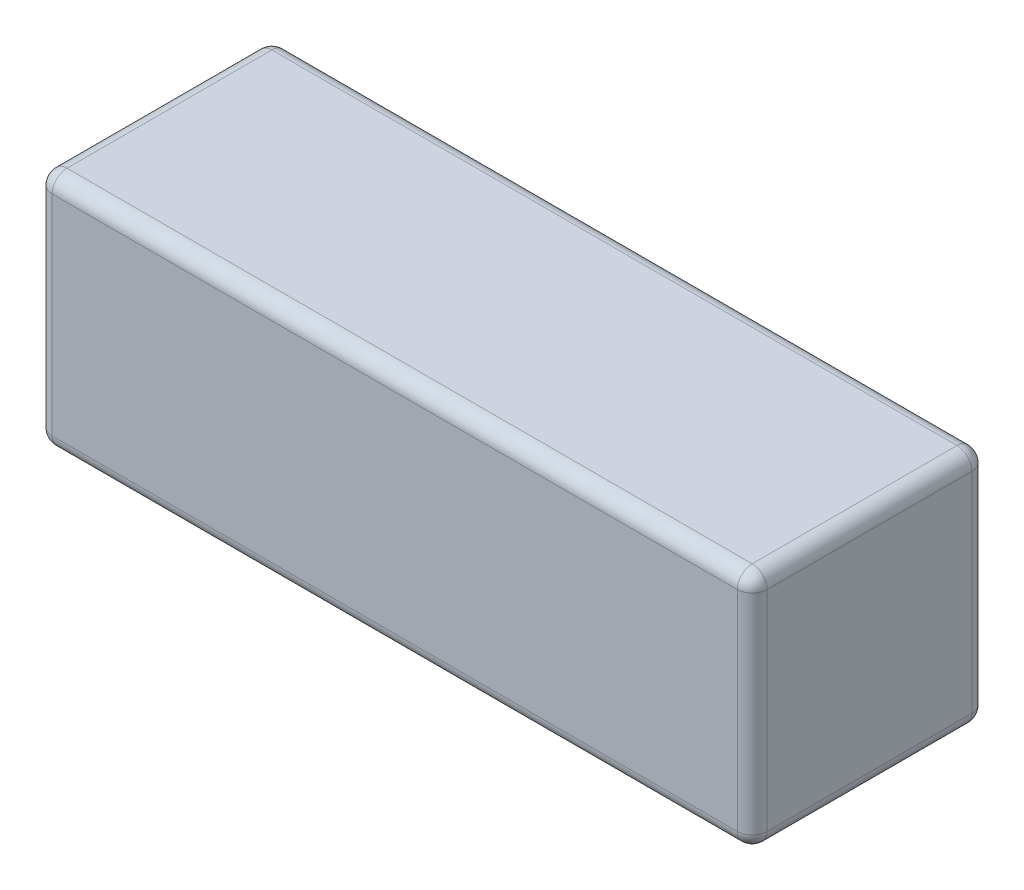
ISO-10303-21;
HEADER;
FILE_DESCRIPTION(('STEP AP214'),'2;1');
FILE_NAME('part.step','',(''),(''),'','','');
FILE_SCHEMA(('AUTOMOTIVE_DESIGN { 1 0 10303 214 1 1 1 1 }'));
ENDSEC;
DATA;
#1=APPLICATION_CONTEXT('core data for automotive mechanical design processes');
#2=APPLICATION_PROTOCOL_DEFINITION('international standard','automotive_design',2000,#1);
#3=PRODUCT_CONTEXT('',#1,'mechanical');
#4=PRODUCT('Part','Part','',(#3));
#5=PRODUCT_RELATED_PRODUCT_CATEGORY('part','',(#4));
#6=PRODUCT_DEFINITION_FORMATION('','',#4);
#7=PRODUCT_DEFINITION_CONTEXT('part definition',#1,'design');
#8=PRODUCT_DEFINITION('design','',#6,#7);
#9=PRODUCT_DEFINITION_SHAPE('','',#8);
#10=(LENGTH_UNIT() NAMED_UNIT(*) SI_UNIT(.MILLI.,.METRE.));
#11=(NAMED_UNIT(*) PLANE_ANGLE_UNIT() SI_UNIT($,.RADIAN.));
#12=(NAMED_UNIT(*) SI_UNIT($,.STERADIAN.) SOLID_ANGLE_UNIT());
#13=UNCERTAINTY_MEASURE_WITH_UNIT(LENGTH_MEASURE(1.E-05),#10,'distance_accuracy_value','');
#14=(GEOMETRIC_REPRESENTATION_CONTEXT(3) GLOBAL_UNCERTAINTY_ASSIGNED_CONTEXT((#13)) GLOBAL_UNIT_ASSIGNED_CONTEXT((#10,
#11,#12)) REPRESENTATION_CONTEXT('',''));
#15=CARTESIAN_POINT('',(0.,0.,0.));
#16=DIRECTION('',(0.,0.,1.));
#17=DIRECTION('',(1.,0.,0.));
#18=AXIS2_PLACEMENT_3D('',#15,#16,#17);
#19=CARTESIAN_POINT('',(-76.2,51.,25.));
#20=DIRECTION('',(1.,0.,0.));
#21=DIRECTION('',(0.,0.,-1.));
#22=AXIS2_PLACEMENT_3D('',#19,#20,#21);
#23=PLANE('',#22);
#24=DIRECTION('',(0.,-1.,0.));
#25=VECTOR('',#24,1.);
#26=CARTESIAN_POINT('',(-76.2,51.,-21.825));
#27=LINE('',#26,#25);
#28=CARTESIAN_POINT('',(-76.2,47.825,-21.825));
#29=VERTEX_POINT('',#28);
#30=CARTESIAN_POINT('',(-76.2,3.175,-21.825));
#31=VERTEX_POINT('',#30);
#32=EDGE_CURVE('E157',#29,#31,#27,.T.);
#33=ORIENTED_EDGE('',*,*,#32,.T.);
#34=DIRECTION('',(0.,0.,1.));
#35=VECTOR('',#34,1.);
#36=CARTESIAN_POINT('',(-76.2,3.175,25.));
#37=LINE('',#36,#35);
#38=CARTESIAN_POINT('',(-76.2,3.175,21.825));
#39=VERTEX_POINT('',#38);
#40=EDGE_CURVE('E234',#31,#39,#37,.T.);
#41=ORIENTED_EDGE('',*,*,#40,.T.);
#42=DIRECTION('',(0.,-1.,0.));
#43=VECTOR('',#42,1.);
#44=CARTESIAN_POINT('',(-76.2,51.,21.825));
#45=LINE('',#44,#43);
#46=CARTESIAN_POINT('',(-76.2,47.825,21.825));
#47=VERTEX_POINT('',#46);
#48=EDGE_CURVE('E227',#39,#47,#45,.F.);
#49=ORIENTED_EDGE('',*,*,#48,.T.);
#50=DIRECTION('',(0.,0.,1.));
#51=VECTOR('',#50,1.);
#52=CARTESIAN_POINT('',(-76.2,47.825,-25.));
#53=LINE('',#52,#51);
#54=EDGE_CURVE('E225',#47,#29,#53,.F.);
#55=ORIENTED_EDGE('',*,*,#54,.T.);
#56=EDGE_LOOP('',(#33,#41,#49,#55));
#57=FACE_BOUND('',#56,.T.);
#58=ADVANCED_FACE('F36',(#57),#23,.F.);
#59=CARTESIAN_POINT('',(76.2,51.,25.));
#60=DIRECTION('',(0.,0.,-1.));
#61=DIRECTION('',(-1.,0.,0.));
#62=AXIS2_PLACEMENT_3D('',#59,#60,#61);
#63=PLANE('',#62);
#64=DIRECTION('',(1.,0.,0.));
#65=VECTOR('',#64,1.);
#66=CARTESIAN_POINT('',(76.2,3.175,25.));
#67=LINE('',#66,#65);
#68=CARTESIAN_POINT('',(-73.025,3.175,25.));
#69=VERTEX_POINT('',#68);
#70=CARTESIAN_POINT('',(73.025,3.175,25.));
#71=VERTEX_POINT('',#70);
#72=EDGE_CURVE('E221',#69,#71,#67,.T.);
#73=ORIENTED_EDGE('',*,*,#72,.T.);
#74=DIRECTION('',(0.,-1.,0.));
#75=VECTOR('',#74,1.);
#76=CARTESIAN_POINT('',(73.025,51.,25.));
#77=LINE('',#76,#75);
#78=CARTESIAN_POINT('',(73.025,47.825,25.));
#79=VERTEX_POINT('',#78);
#80=EDGE_CURVE('E218',#71,#79,#77,.F.);
#81=ORIENTED_EDGE('',*,*,#80,.T.);
#82=DIRECTION('',(1.,0.,0.));
#83=VECTOR('',#82,1.);
#84=CARTESIAN_POINT('',(-76.2,47.825,25.));
#85=LINE('',#84,#83);
#86=CARTESIAN_POINT('',(-73.025,47.825,25.));
#87=VERTEX_POINT('',#86);
#88=EDGE_CURVE('E211',#79,#87,#85,.F.);
#89=ORIENTED_EDGE('',*,*,#88,.T.);
#90=DIRECTION('',(0.,-1.,0.));
#91=VECTOR('',#90,1.);
#92=CARTESIAN_POINT('',(-73.025,51.,25.));
#93=LINE('',#92,#91);
#94=EDGE_CURVE('E214',#87,#69,#93,.T.);
#95=ORIENTED_EDGE('',*,*,#94,.T.);
#96=EDGE_LOOP('',(#73,#81,#89,#95));
#97=FACE_BOUND('',#96,.T.);
#98=ADVANCED_FACE('F219',(#97),#63,.F.);
#99=CARTESIAN_POINT('',(76.2,51.,25.));
#100=DIRECTION('',(-1.,0.,0.));
#101=DIRECTION('',(0.,0.,1.));
#102=AXIS2_PLACEMENT_3D('',#99,#100,#101);
#103=PLANE('',#102);
#104=DIRECTION('',(0.,0.,-1.));
#105=VECTOR('',#104,1.);
#106=CARTESIAN_POINT('',(76.2,3.175,25.));
#107=LINE('',#106,#105);
#108=CARTESIAN_POINT('',(76.2,3.175,21.825));
#109=VERTEX_POINT('',#108);
#110=CARTESIAN_POINT('',(76.2,3.175,-21.825));
#111=VERTEX_POINT('',#110);
#112=EDGE_CURVE('E283',#109,#111,#107,.T.);
#113=ORIENTED_EDGE('',*,*,#112,.T.);
#114=DIRECTION('',(0.,-1.,0.));
#115=VECTOR('',#114,1.);
#116=CARTESIAN_POINT('',(76.2,51.,-21.825));
#117=LINE('',#116,#115);
#118=CARTESIAN_POINT('',(76.2,47.825,-21.825));
#119=VERTEX_POINT('',#118);
#120=EDGE_CURVE('E215',#111,#119,#117,.F.);
#121=ORIENTED_EDGE('',*,*,#120,.T.);
#122=DIRECTION('',(0.,0.,-1.));
#123=VECTOR('',#122,1.);
#124=CARTESIAN_POINT('',(76.2,47.825,25.));
#125=LINE('',#124,#123);
#126=CARTESIAN_POINT('',(76.2,47.825,21.825));
#127=VERTEX_POINT('',#126);
#128=EDGE_CURVE('E276',#119,#127,#125,.F.);
#129=ORIENTED_EDGE('',*,*,#128,.T.);
#130=DIRECTION('',(0.,-1.,0.));
#131=VECTOR('',#130,1.);
#132=CARTESIAN_POINT('',(76.2,51.,21.825));
#133=LINE('',#132,#131);
#134=EDGE_CURVE('E278',#127,#109,#133,.T.);
#135=ORIENTED_EDGE('',*,*,#134,.T.);
#136=EDGE_LOOP('',(#113,#121,#129,#135));
#137=FACE_BOUND('',#136,.T.);
#138=ADVANCED_FACE('F308',(#137),#103,.F.);
#139=CARTESIAN_POINT('',(76.2,51.,-25.));
#140=DIRECTION('',(0.,0.,1.));
#141=DIRECTION('',(1.,0.,0.));
#142=AXIS2_PLACEMENT_3D('',#139,#140,#141);
#143=PLANE('',#142);
#144=DIRECTION('',(0.,-1.,0.));
#145=VECTOR('',#144,1.);
#146=CARTESIAN_POINT('',(73.025,51.,-25.));
#147=LINE('',#146,#145);
#148=CARTESIAN_POINT('',(73.025,47.825,-25.));
#149=VERTEX_POINT('',#148);
#150=CARTESIAN_POINT('',(73.025,3.175,-25.));
#151=VERTEX_POINT('',#150);
#152=EDGE_CURVE('E135',#149,#151,#147,.T.);
#153=ORIENTED_EDGE('',*,*,#152,.T.);
#154=DIRECTION('',(-1.,0.,0.));
#155=VECTOR('',#154,1.);
#156=CARTESIAN_POINT('',(76.2,3.175,-25.));
#157=LINE('',#156,#155);
#158=CARTESIAN_POINT('',(-73.025,3.175,-25.));
#159=VERTEX_POINT('',#158);
#160=EDGE_CURVE('E131',#151,#159,#157,.T.);
#161=ORIENTED_EDGE('',*,*,#160,.T.);
#162=DIRECTION('',(0.,-1.,0.));
#163=VECTOR('',#162,1.);
#164=CARTESIAN_POINT('',(-73.025,51.,-25.));
#165=LINE('',#164,#163);
#166=CARTESIAN_POINT('',(-73.025,47.825,-25.));
#167=VERTEX_POINT('',#166);
#168=EDGE_CURVE('E125',#159,#167,#165,.F.);
#169=ORIENTED_EDGE('',*,*,#168,.T.);
#170=DIRECTION('',(-1.,0.,0.));
#171=VECTOR('',#170,1.);
#172=CARTESIAN_POINT('',(76.2,47.825,-25.));
#173=LINE('',#172,#171);
#174=EDGE_CURVE('E128',#167,#149,#173,.F.);
#175=ORIENTED_EDGE('',*,*,#174,.T.);
#176=EDGE_LOOP('',(#153,#161,#169,#175));
#177=FACE_BOUND('',#176,.T.);
#178=ADVANCED_FACE('F127',(#177),#143,.F.);
#179=CARTESIAN_POINT('',(0.,51.,0.));
#180=DIRECTION('',(0.,1.,0.));
#181=DIRECTION('',(0.,0.,1.));
#182=AXIS2_PLACEMENT_3D('',#179,#180,#181);
#183=PLANE('',#182);
#184=DIRECTION('',(0.,0.,-1.));
#185=VECTOR('',#184,1.);
#186=CARTESIAN_POINT('',(73.025,51.,-25.));
#187=LINE('',#186,#185);
#188=CARTESIAN_POINT('',(73.025,51.,21.825));
#189=VERTEX_POINT('',#188);
#190=CARTESIAN_POINT('',(73.025,51.,-21.825));
#191=VERTEX_POINT('',#190);
#192=EDGE_CURVE('E45',#189,#191,#187,.T.);
#193=ORIENTED_EDGE('',*,*,#192,.T.);
#194=DIRECTION('',(-1.,0.,0.));
#195=VECTOR('',#194,1.);
#196=CARTESIAN_POINT('',(-76.2,51.,-21.825));
#197=LINE('',#196,#195);
#198=CARTESIAN_POINT('',(-73.025,51.,-21.825));
#199=VERTEX_POINT('',#198);
#200=EDGE_CURVE('E11',#191,#199,#197,.T.);
#201=ORIENTED_EDGE('',*,*,#200,.T.);
#202=DIRECTION('',(0.,0.,1.));
#203=VECTOR('',#202,1.);
#204=CARTESIAN_POINT('',(-73.025,51.,25.));
#205=LINE('',#204,#203);
#206=CARTESIAN_POINT('',(-73.025,51.,21.825));
#207=VERTEX_POINT('',#206);
#208=EDGE_CURVE('E236',#199,#207,#205,.T.);
#209=ORIENTED_EDGE('',*,*,#208,.T.);
#210=DIRECTION('',(1.,0.,0.));
#211=VECTOR('',#210,1.);
#212=CARTESIAN_POINT('',(76.2,51.,21.825));
#213=LINE('',#212,#211);
#214=EDGE_CURVE('E56',#207,#189,#213,.T.);
#215=ORIENTED_EDGE('',*,*,#214,.T.);
#216=EDGE_LOOP('',(#193,#201,#209,#215));
#217=FACE_BOUND('',#216,.T.);
#218=ADVANCED_FACE('F486',(#217),#183,.T.);
#219=CARTESIAN_POINT('',(0.,0.,0.));
#220=DIRECTION('',(0.,1.,0.));
#221=DIRECTION('',(0.,0.,1.));
#222=AXIS2_PLACEMENT_3D('',#219,#220,#221);
#223=PLANE('',#222);
#224=DIRECTION('',(0.,0.,1.));
#225=VECTOR('',#224,1.);
#226=CARTESIAN_POINT('',(-73.025,0.,0.));
#227=LINE('',#226,#225);
#228=CARTESIAN_POINT('',(-73.025,0.,21.825));
#229=VERTEX_POINT('',#228);
#230=CARTESIAN_POINT('',(-73.025,0.,-21.825));
#231=VERTEX_POINT('',#230);
#232=EDGE_CURVE('E272',#229,#231,#227,.F.);
#233=ORIENTED_EDGE('',*,*,#232,.T.);
#234=DIRECTION('',(-1.,0.,0.));
#235=VECTOR('',#234,1.);
#236=CARTESIAN_POINT('',(0.,0.,-21.825));
#237=LINE('',#236,#235);
#238=CARTESIAN_POINT('',(73.025,0.,-21.825));
#239=VERTEX_POINT('',#238);
#240=EDGE_CURVE('E266',#231,#239,#237,.F.);
#241=ORIENTED_EDGE('',*,*,#240,.T.);
#242=DIRECTION('',(0.,0.,-1.));
#243=VECTOR('',#242,1.);
#244=CARTESIAN_POINT('',(73.025,0.,0.));
#245=LINE('',#244,#243);
#246=CARTESIAN_POINT('',(73.025,0.,21.825));
#247=VERTEX_POINT('',#246);
#248=EDGE_CURVE('E260',#239,#247,#245,.F.);
#249=ORIENTED_EDGE('',*,*,#248,.T.);
#250=DIRECTION('',(1.,0.,0.));
#251=VECTOR('',#250,1.);
#252=CARTESIAN_POINT('',(0.,0.,21.825));
#253=LINE('',#252,#251);
#254=EDGE_CURVE('E267',#247,#229,#253,.F.);
#255=ORIENTED_EDGE('',*,*,#254,.T.);
#256=EDGE_LOOP('',(#233,#241,#249,#255));
#257=FACE_BOUND('',#256,.T.);
#258=ADVANCED_FACE('F270',(#257),#223,.F.);
#259=CARTESIAN_POINT('',(0.,47.825,21.825));
#260=DIRECTION('',(-1.,0.,0.));
#261=DIRECTION('',(0.,0.,1.));
#262=AXIS2_PLACEMENT_3D('',#259,#260,#261);
#263=CYLINDRICAL_SURFACE('',#262,3.175);
#264=CARTESIAN_POINT('',(73.025,47.825,21.825));
#265=DIRECTION('',(1.,0.,0.));
#266=DIRECTION('',(0.,0.,-1.));
#267=AXIS2_PLACEMENT_3D('',#264,#265,#266);
#268=CIRCLE('',#267,3.175);
#269=EDGE_CURVE('E40',#189,#79,#268,.T.);
#270=ORIENTED_EDGE('',*,*,#269,.F.);
#271=ORIENTED_EDGE('',*,*,#214,.F.);
#272=CARTESIAN_POINT('',(-73.025,47.825,21.825));
#273=DIRECTION('',(-1.,0.,0.));
#274=DIRECTION('',(0.,-1.,0.));
#275=AXIS2_PLACEMENT_3D('',#272,#273,#274);
#276=CIRCLE('',#275,3.175);
#277=EDGE_CURVE('E197',#87,#207,#276,.T.);
#278=ORIENTED_EDGE('',*,*,#277,.F.);
#279=ORIENTED_EDGE('',*,*,#88,.F.);
#280=EDGE_LOOP('',(#270,#271,#278,#279));
#281=FACE_BOUND('',#280,.T.);
#282=ADVANCED_FACE('F38',(#281),#263,.T.);
#283=CARTESIAN_POINT('',(73.025,47.825,21.825));
#284=DIRECTION('',(0.,0.,1.));
#285=DIRECTION('',(1.,0.,0.));
#286=AXIS2_PLACEMENT_3D('',#283,#284,#285);
#287=SPHERICAL_SURFACE('',#286,3.175);
#288=CARTESIAN_POINT('',(73.025,47.825,21.825));
#289=DIRECTION('',(0.,0.,1.));
#290=DIRECTION('',(1.,0.,0.));
#291=AXIS2_PLACEMENT_3D('',#288,#289,#290);
#292=CIRCLE('',#291,3.175);
#293=EDGE_CURVE('E193',#189,#127,#292,.F.);
#294=ORIENTED_EDGE('',*,*,#293,.F.);
#295=ORIENTED_EDGE('',*,*,#269,.T.);
#296=CARTESIAN_POINT('',(73.025,47.825,21.825));
#297=DIRECTION('',(0.,1.,0.));
#298=DIRECTION('',(0.,0.,1.));
#299=AXIS2_PLACEMENT_3D('',#296,#297,#298);
#300=CIRCLE('',#299,3.175);
#301=EDGE_CURVE('E196',#127,#79,#300,.F.);
#302=ORIENTED_EDGE('',*,*,#301,.F.);
#303=EDGE_LOOP('',(#294,#295,#302));
#304=FACE_BOUND('',#303,.T.);
#305=ADVANCED_FACE('F208',(#304),#287,.T.);
#306=CARTESIAN_POINT('',(-73.025,47.825,21.825));
#307=DIRECTION('',(0.,0.,1.));
#308=DIRECTION('',(1.,0.,0.));
#309=AXIS2_PLACEMENT_3D('',#306,#307,#308);
#310=SPHERICAL_SURFACE('',#309,3.175);
#311=CARTESIAN_POINT('',(-73.025,47.825,21.825));
#312=DIRECTION('',(0.,1.,0.));
#313=DIRECTION('',(0.,0.,1.));
#314=AXIS2_PLACEMENT_3D('',#311,#312,#313);
#315=CIRCLE('',#314,3.175);
#316=EDGE_CURVE('E187',#87,#47,#315,.F.);
#317=ORIENTED_EDGE('',*,*,#316,.F.);
#318=ORIENTED_EDGE('',*,*,#277,.T.);
#319=CARTESIAN_POINT('',(-73.025,47.825,21.825));
#320=DIRECTION('',(0.,0.,1.));
#321=DIRECTION('',(1.,0.,0.));
#322=AXIS2_PLACEMENT_3D('',#319,#320,#321);
#323=CIRCLE('',#322,3.175);
#324=EDGE_CURVE('E190',#47,#207,#323,.F.);
#325=ORIENTED_EDGE('',*,*,#324,.F.);
#326=EDGE_LOOP('',(#317,#318,#325));
#327=FACE_BOUND('',#326,.T.);
#328=ADVANCED_FACE('F459',(#327),#310,.T.);
#329=CARTESIAN_POINT('',(73.025,51.,21.825));
#330=DIRECTION('',(0.,-1.,0.));
#331=DIRECTION('',(0.,0.,-1.));
#332=AXIS2_PLACEMENT_3D('',#329,#330,#331);
#333=CYLINDRICAL_SURFACE('',#332,3.175);
#334=ORIENTED_EDGE('',*,*,#301,.T.);
#335=ORIENTED_EDGE('',*,*,#80,.F.);
#336=CARTESIAN_POINT('',(73.025,3.175,21.825));
#337=DIRECTION('',(0.,-1.,0.));
#338=DIRECTION('',(0.,0.,-1.));
#339=AXIS2_PLACEMENT_3D('',#336,#337,#338);
#340=CIRCLE('',#339,3.175);
#341=EDGE_CURVE('E181',#109,#71,#340,.T.);
#342=ORIENTED_EDGE('',*,*,#341,.F.);
#343=ORIENTED_EDGE('',*,*,#134,.F.);
#344=EDGE_LOOP('',(#334,#335,#342,#343));
#345=FACE_BOUND('',#344,.T.);
#346=ADVANCED_FACE('F310',(#345),#333,.T.);
#347=CARTESIAN_POINT('',(73.025,47.825,0.));
#348=DIRECTION('',(0.,0.,1.));
#349=DIRECTION('',(1.,0.,0.));
#350=AXIS2_PLACEMENT_3D('',#347,#348,#349);
#351=CYLINDRICAL_SURFACE('',#350,3.175);
#352=ORIENTED_EDGE('',*,*,#293,.T.);
#353=ORIENTED_EDGE('',*,*,#128,.F.);
#354=CARTESIAN_POINT('',(73.025,47.825,-21.825));
#355=DIRECTION('',(0.,0.,-1.));
#356=DIRECTION('',(-1.,0.,0.));
#357=AXIS2_PLACEMENT_3D('',#354,#355,#356);
#358=CIRCLE('',#357,3.175);
#359=EDGE_CURVE('E178',#191,#119,#358,.T.);
#360=ORIENTED_EDGE('',*,*,#359,.F.);
#361=ORIENTED_EDGE('',*,*,#192,.F.);
#362=EDGE_LOOP('',(#352,#353,#360,#361));
#363=FACE_BOUND('',#362,.T.);
#364=ADVANCED_FACE('F443',(#363),#351,.T.);
#365=CARTESIAN_POINT('',(0.,47.825,-21.825));
#366=DIRECTION('',(1.,0.,0.));
#367=DIRECTION('',(0.,0.,-1.));
#368=AXIS2_PLACEMENT_3D('',#365,#366,#367);
#369=CYLINDRICAL_SURFACE('',#368,3.175);
#370=CARTESIAN_POINT('',(-73.025,47.825,-21.825));
#371=DIRECTION('',(-1.,0.,0.));
#372=DIRECTION('',(0.,0.,1.));
#373=AXIS2_PLACEMENT_3D('',#370,#371,#372);
#374=CIRCLE('',#373,3.175);
#375=EDGE_CURVE('E141',#199,#167,#374,.T.);
#376=ORIENTED_EDGE('',*,*,#375,.F.);
#377=ORIENTED_EDGE('',*,*,#200,.F.);
#378=CARTESIAN_POINT('',(73.025,47.825,-21.825));
#379=DIRECTION('',(1.,0.,0.));
#380=DIRECTION('',(0.,0.,-1.));
#381=AXIS2_PLACEMENT_3D('',#378,#379,#380);
#382=CIRCLE('',#381,3.175);
#383=EDGE_CURVE('E144',#149,#191,#382,.T.);
#384=ORIENTED_EDGE('',*,*,#383,.F.);
#385=ORIENTED_EDGE('',*,*,#174,.F.);
#386=EDGE_LOOP('',(#376,#377,#384,#385));
#387=FACE_BOUND('',#386,.T.);
#388=ADVANCED_FACE('F140',(#387),#369,.T.);
#389=CARTESIAN_POINT('',(-73.025,47.825,0.));
#390=DIRECTION('',(0.,0.,-1.));
#391=DIRECTION('',(-1.,0.,0.));
#392=AXIS2_PLACEMENT_3D('',#389,#390,#391);
#393=CYLINDRICAL_SURFACE('',#392,3.175);
#394=ORIENTED_EDGE('',*,*,#324,.T.);
#395=ORIENTED_EDGE('',*,*,#208,.F.);
#396=CARTESIAN_POINT('',(-73.025,47.825,-21.825));
#397=DIRECTION('',(0.,0.,-1.));
#398=DIRECTION('',(0.,1.,0.));
#399=AXIS2_PLACEMENT_3D('',#396,#397,#398);
#400=CIRCLE('',#399,3.175);
#401=EDGE_CURVE('E153',#29,#199,#400,.T.);
#402=ORIENTED_EDGE('',*,*,#401,.F.);
#403=ORIENTED_EDGE('',*,*,#54,.F.);
#404=EDGE_LOOP('',(#394,#395,#402,#403));
#405=FACE_BOUND('',#404,.T.);
#406=ADVANCED_FACE('F427',(#405),#393,.T.);
#407=CARTESIAN_POINT('',(-73.025,51.,21.825));
#408=DIRECTION('',(0.,-1.,0.));
#409=DIRECTION('',(0.,0.,-1.));
#410=AXIS2_PLACEMENT_3D('',#407,#408,#409);
#411=CYLINDRICAL_SURFACE('',#410,3.175);
#412=ORIENTED_EDGE('',*,*,#316,.T.);
#413=ORIENTED_EDGE('',*,*,#48,.F.);
#414=CARTESIAN_POINT('',(-73.025,3.175,21.825));
#415=DIRECTION('',(0.,-1.,0.));
#416=DIRECTION('',(0.,0.,-1.));
#417=AXIS2_PLACEMENT_3D('',#414,#415,#416);
#418=CIRCLE('',#417,3.175);
#419=EDGE_CURVE('E173',#69,#39,#418,.T.);
#420=ORIENTED_EDGE('',*,*,#419,.F.);
#421=ORIENTED_EDGE('',*,*,#94,.F.);
#422=EDGE_LOOP('',(#412,#413,#420,#421));
#423=FACE_BOUND('',#422,.T.);
#424=ADVANCED_FACE('F294',(#423),#411,.T.);
#425=CARTESIAN_POINT('',(76.2,3.175,21.825));
#426=DIRECTION('',(1.,0.,0.));
#427=DIRECTION('',(0.,0.,-1.));
#428=AXIS2_PLACEMENT_3D('',#425,#426,#427);
#429=CYLINDRICAL_SURFACE('',#428,3.175);
#430=CARTESIAN_POINT('',(73.025,3.175,21.825));
#431=DIRECTION('',(1.,0.,0.));
#432=DIRECTION('',(0.,0.,-1.));
#433=AXIS2_PLACEMENT_3D('',#430,#431,#432);
#434=CIRCLE('',#433,3.175);
#435=EDGE_CURVE('E184',#71,#247,#434,.T.);
#436=ORIENTED_EDGE('',*,*,#435,.F.);
#437=ORIENTED_EDGE('',*,*,#72,.F.);
#438=CARTESIAN_POINT('',(-73.025,3.175,21.825));
#439=DIRECTION('',(-1.,0.,0.));
#440=DIRECTION('',(0.,0.,1.));
#441=AXIS2_PLACEMENT_3D('',#438,#439,#440);
#442=CIRCLE('',#441,3.175);
#443=EDGE_CURVE('E170',#229,#69,#442,.T.);
#444=ORIENTED_EDGE('',*,*,#443,.F.);
#445=ORIENTED_EDGE('',*,*,#254,.F.);
#446=EDGE_LOOP('',(#436,#437,#444,#445));
#447=FACE_BOUND('',#446,.T.);
#448=ADVANCED_FACE('F291',(#447),#429,.T.);
#449=CARTESIAN_POINT('',(73.025,3.175,21.825));
#450=DIRECTION('',(0.,0.,1.));
#451=DIRECTION('',(1.,0.,0.));
#452=AXIS2_PLACEMENT_3D('',#449,#450,#451);
#453=SPHERICAL_SURFACE('',#452,3.175);
#454=ORIENTED_EDGE('',*,*,#341,.T.);
#455=ORIENTED_EDGE('',*,*,#435,.T.);
#456=CARTESIAN_POINT('',(73.025,3.175,21.825));
#457=DIRECTION('',(0.,0.,1.));
#458=DIRECTION('',(1.,0.,0.));
#459=AXIS2_PLACEMENT_3D('',#456,#457,#458);
#460=CIRCLE('',#459,3.175);
#461=EDGE_CURVE('E161',#109,#247,#460,.F.);
#462=ORIENTED_EDGE('',*,*,#461,.F.);
#463=EDGE_LOOP('',(#454,#455,#462));
#464=FACE_BOUND('',#463,.T.);
#465=ADVANCED_FACE('F312',(#464),#453,.T.);
#466=CARTESIAN_POINT('',(73.025,47.825,-21.825));
#467=DIRECTION('',(0.,0.,1.));
#468=DIRECTION('',(1.,0.,0.));
#469=AXIS2_PLACEMENT_3D('',#466,#467,#468);
#470=SPHERICAL_SURFACE('',#469,3.175);
#471=ORIENTED_EDGE('',*,*,#383,.T.);
#472=ORIENTED_EDGE('',*,*,#359,.T.);
#473=CARTESIAN_POINT('',(73.025,47.825,-21.825));
#474=DIRECTION('',(0.,1.,0.));
#475=DIRECTION('',(0.,0.,1.));
#476=AXIS2_PLACEMENT_3D('',#473,#474,#475);
#477=CIRCLE('',#476,3.175);
#478=EDGE_CURVE('E158',#149,#119,#477,.F.);
#479=ORIENTED_EDGE('',*,*,#478,.F.);
#480=EDGE_LOOP('',(#471,#472,#479));
#481=FACE_BOUND('',#480,.T.);
#482=ADVANCED_FACE('F314',(#481),#470,.T.);
#483=CARTESIAN_POINT('',(-73.025,47.825,-21.825));
#484=DIRECTION('',(0.,0.,1.));
#485=DIRECTION('',(1.,0.,0.));
#486=AXIS2_PLACEMENT_3D('',#483,#484,#485);
#487=SPHERICAL_SURFACE('',#486,3.175);
#488=ORIENTED_EDGE('',*,*,#401,.T.);
#489=ORIENTED_EDGE('',*,*,#375,.T.);
#490=CARTESIAN_POINT('',(-73.025,47.825,-21.825));
#491=DIRECTION('',(0.,1.,0.));
#492=DIRECTION('',(0.,0.,1.));
#493=AXIS2_PLACEMENT_3D('',#490,#491,#492);
#494=CIRCLE('',#493,3.175);
#495=EDGE_CURVE('E150',#29,#167,#494,.F.);
#496=ORIENTED_EDGE('',*,*,#495,.F.);
#497=EDGE_LOOP('',(#488,#489,#496));
#498=FACE_BOUND('',#497,.T.);
#499=ADVANCED_FACE('F149',(#498),#487,.T.);
#500=CARTESIAN_POINT('',(-73.025,3.175,21.825));
#501=DIRECTION('',(0.,0.,1.));
#502=DIRECTION('',(1.,0.,0.));
#503=AXIS2_PLACEMENT_3D('',#500,#501,#502);
#504=SPHERICAL_SURFACE('',#503,3.175);
#505=ORIENTED_EDGE('',*,*,#443,.T.);
#506=ORIENTED_EDGE('',*,*,#419,.T.);
#507=CARTESIAN_POINT('',(-73.025,3.175,21.825));
#508=DIRECTION('',(0.,0.,1.));
#509=DIRECTION('',(1.,0.,0.));
#510=AXIS2_PLACEMENT_3D('',#507,#508,#509);
#511=CIRCLE('',#510,3.175);
#512=EDGE_CURVE('E159',#229,#39,#511,.F.);
#513=ORIENTED_EDGE('',*,*,#512,.F.);
#514=EDGE_LOOP('',(#505,#506,#513));
#515=FACE_BOUND('',#514,.T.);
#516=ADVANCED_FACE('F296',(#515),#504,.T.);
#517=CARTESIAN_POINT('',(73.025,3.175,25.));
#518=DIRECTION('',(0.,0.,-1.));
#519=DIRECTION('',(-1.,0.,0.));
#520=AXIS2_PLACEMENT_3D('',#517,#518,#519);
#521=CYLINDRICAL_SURFACE('',#520,3.175);
#522=ORIENTED_EDGE('',*,*,#461,.T.);
#523=ORIENTED_EDGE('',*,*,#248,.F.);
#524=CARTESIAN_POINT('',(73.025,3.175,-21.825));
#525=DIRECTION('',(0.,0.,-1.));
#526=DIRECTION('',(-1.,0.,0.));
#527=AXIS2_PLACEMENT_3D('',#524,#525,#526);
#528=CIRCLE('',#527,3.175);
#529=EDGE_CURVE('E164',#111,#239,#528,.T.);
#530=ORIENTED_EDGE('',*,*,#529,.F.);
#531=ORIENTED_EDGE('',*,*,#112,.F.);
#532=EDGE_LOOP('',(#522,#523,#530,#531));
#533=FACE_BOUND('',#532,.T.);
#534=ADVANCED_FACE('F262',(#533),#521,.T.);
#535=CARTESIAN_POINT('',(73.025,51.,-21.825));
#536=DIRECTION('',(0.,-1.,0.));
#537=DIRECTION('',(0.,0.,-1.));
#538=AXIS2_PLACEMENT_3D('',#535,#536,#537);
#539=CYLINDRICAL_SURFACE('',#538,3.175);
#540=ORIENTED_EDGE('',*,*,#478,.T.);
#541=ORIENTED_EDGE('',*,*,#120,.F.);
#542=CARTESIAN_POINT('',(73.025,3.175,-21.825));
#543=DIRECTION('',(0.,-1.,0.));
#544=DIRECTION('',(0.,0.,-1.));
#545=AXIS2_PLACEMENT_3D('',#542,#543,#544);
#546=CIRCLE('',#545,3.175);
#547=EDGE_CURVE('E249',#151,#111,#546,.T.);
#548=ORIENTED_EDGE('',*,*,#547,.F.);
#549=ORIENTED_EDGE('',*,*,#152,.F.);
#550=EDGE_LOOP('',(#540,#541,#548,#549));
#551=FACE_BOUND('',#550,.T.);
#552=ADVANCED_FACE('F306',(#551),#539,.T.);
#553=CARTESIAN_POINT('',(-73.025,51.,-21.825));
#554=DIRECTION('',(0.,-1.,0.));
#555=DIRECTION('',(0.,0.,-1.));
#556=AXIS2_PLACEMENT_3D('',#553,#554,#555);
#557=CYLINDRICAL_SURFACE('',#556,3.175);
#558=ORIENTED_EDGE('',*,*,#495,.T.);
#559=ORIENTED_EDGE('',*,*,#168,.F.);
#560=CARTESIAN_POINT('',(-73.025,3.175,-21.825));
#561=DIRECTION('',(0.,-1.,0.));
#562=DIRECTION('',(0.,0.,-1.));
#563=AXIS2_PLACEMENT_3D('',#560,#561,#562);
#564=CIRCLE('',#563,3.175);
#565=EDGE_CURVE('E246',#31,#159,#564,.T.);
#566=ORIENTED_EDGE('',*,*,#565,.F.);
#567=ORIENTED_EDGE('',*,*,#32,.F.);
#568=EDGE_LOOP('',(#558,#559,#566,#567));
#569=FACE_BOUND('',#568,.T.);
#570=ADVANCED_FACE('F155',(#569),#557,.T.);
#571=CARTESIAN_POINT('',(-73.025,3.175,25.));
#572=DIRECTION('',(0.,0.,1.));
#573=DIRECTION('',(1.,0.,0.));
#574=AXIS2_PLACEMENT_3D('',#571,#572,#573);
#575=CYLINDRICAL_SURFACE('',#574,3.175);
#576=ORIENTED_EDGE('',*,*,#512,.T.);
#577=ORIENTED_EDGE('',*,*,#40,.F.);
#578=CARTESIAN_POINT('',(-73.025,3.175,-21.825));
#579=DIRECTION('',(0.,0.,-1.));
#580=DIRECTION('',(-1.,0.,0.));
#581=AXIS2_PLACEMENT_3D('',#578,#579,#580);
#582=CIRCLE('',#581,3.175);
#583=EDGE_CURVE('E244',#231,#31,#582,.T.);
#584=ORIENTED_EDGE('',*,*,#583,.F.);
#585=ORIENTED_EDGE('',*,*,#232,.F.);
#586=EDGE_LOOP('',(#576,#577,#584,#585));
#587=FACE_BOUND('',#586,.T.);
#588=ADVANCED_FACE('F299',(#587),#575,.T.);
#589=CARTESIAN_POINT('',(73.025,3.175,-21.825));
#590=DIRECTION('',(0.,0.,1.));
#591=DIRECTION('',(1.,0.,0.));
#592=AXIS2_PLACEMENT_3D('',#589,#590,#591);
#593=SPHERICAL_SURFACE('',#592,3.175);
#594=ORIENTED_EDGE('',*,*,#547,.T.);
#595=ORIENTED_EDGE('',*,*,#529,.T.);
#596=CARTESIAN_POINT('',(73.025,3.175,-21.825));
#597=DIRECTION('',(1.,0.,0.));
#598=DIRECTION('',(0.,0.,-1.));
#599=AXIS2_PLACEMENT_3D('',#596,#597,#598);
#600=CIRCLE('',#599,3.175);
#601=EDGE_CURVE('E242',#151,#239,#600,.F.);
#602=ORIENTED_EDGE('',*,*,#601,.F.);
#603=EDGE_LOOP('',(#594,#595,#602));
#604=FACE_BOUND('',#603,.T.);
#605=ADVANCED_FACE('F256',(#604),#593,.T.);
#606=CARTESIAN_POINT('',(-73.025,3.175,-21.825));
#607=DIRECTION('',(0.,0.,1.));
#608=DIRECTION('',(1.,0.,0.));
#609=AXIS2_PLACEMENT_3D('',#606,#607,#608);
#610=SPHERICAL_SURFACE('',#609,3.175);
#611=ORIENTED_EDGE('',*,*,#583,.T.);
#612=ORIENTED_EDGE('',*,*,#565,.T.);
#613=CARTESIAN_POINT('',(-73.025,3.175,-21.825));
#614=DIRECTION('',(-1.,0.,0.));
#615=DIRECTION('',(0.,0.,1.));
#616=AXIS2_PLACEMENT_3D('',#613,#614,#615);
#617=CIRCLE('',#616,3.175);
#618=EDGE_CURVE('E240',#231,#159,#617,.F.);
#619=ORIENTED_EDGE('',*,*,#618,.F.);
#620=EDGE_LOOP('',(#611,#612,#619));
#621=FACE_BOUND('',#620,.T.);
#622=ADVANCED_FACE('F335',(#621),#610,.T.);
#623=CARTESIAN_POINT('',(76.2,3.175,-21.825));
#624=DIRECTION('',(-1.,0.,0.));
#625=DIRECTION('',(0.,0.,1.));
#626=AXIS2_PLACEMENT_3D('',#623,#624,#625);
#627=CYLINDRICAL_SURFACE('',#626,3.175);
#628=ORIENTED_EDGE('',*,*,#601,.T.);
#629=ORIENTED_EDGE('',*,*,#240,.F.);
#630=ORIENTED_EDGE('',*,*,#618,.T.);
#631=ORIENTED_EDGE('',*,*,#160,.F.);
#632=EDGE_LOOP('',(#628,#629,#630,#631));
#633=FACE_BOUND('',#632,.T.);
#634=ADVANCED_FACE('F332',(#633),#627,.T.);
#635=CLOSED_SHELL('',(#58,#98,#138,#178,#218,#258,#282,#305,#328,#346,#364,#388,#406,#424,#448,
#465,#482,#499,#516,#534,#552,#570,#588,#605,#622,#634));
#636=MANIFOLD_SOLID_BREP('B2',#635);
#637=ADVANCED_BREP_SHAPE_REPRESENTATION('',(#18,#636),#14);
#638=SHAPE_DEFINITION_REPRESENTATION(#9,#637);
ENDSEC;
END-ISO-10303-21;
